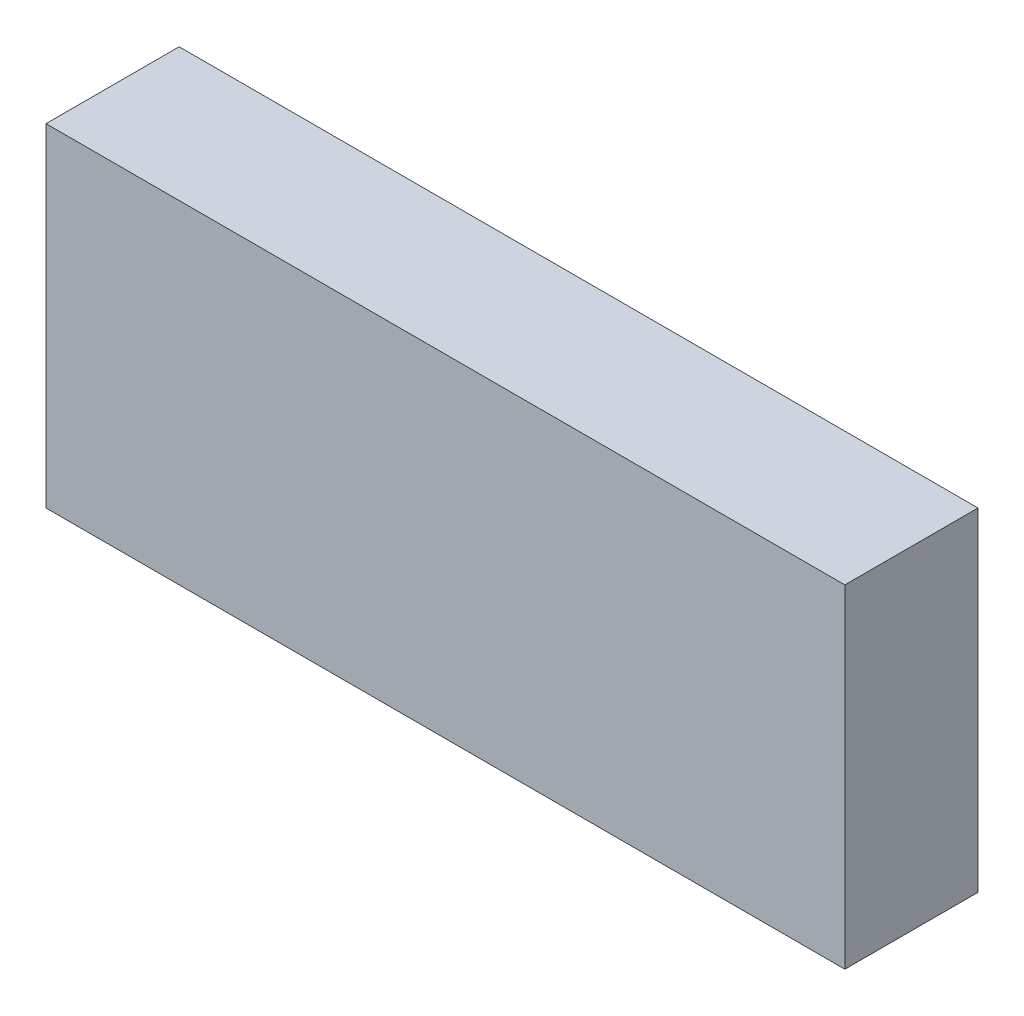
ISO-10303-21;
HEADER;
FILE_DESCRIPTION(('STEP AP214'),'2;1');
FILE_NAME('part.step','',(''),(''),'','','');
FILE_SCHEMA(('AUTOMOTIVE_DESIGN { 1 0 10303 214 1 1 1 1 }'));
ENDSEC;
DATA;
#1=APPLICATION_CONTEXT('core data for automotive mechanical design processes');
#2=APPLICATION_PROTOCOL_DEFINITION('international standard','automotive_design',2000,#1);
#3=PRODUCT_CONTEXT('',#1,'mechanical');
#4=PRODUCT('Part','Part','',(#3));
#5=PRODUCT_RELATED_PRODUCT_CATEGORY('part','',(#4));
#6=PRODUCT_DEFINITION_FORMATION('','',#4);
#7=PRODUCT_DEFINITION_CONTEXT('part definition',#1,'design');
#8=PRODUCT_DEFINITION('design','',#6,#7);
#9=PRODUCT_DEFINITION_SHAPE('','',#8);
#10=(LENGTH_UNIT() NAMED_UNIT(*) SI_UNIT(.MILLI.,.METRE.));
#11=(NAMED_UNIT(*) PLANE_ANGLE_UNIT() SI_UNIT($,.RADIAN.));
#12=(NAMED_UNIT(*) SI_UNIT($,.STERADIAN.) SOLID_ANGLE_UNIT());
#13=UNCERTAINTY_MEASURE_WITH_UNIT(LENGTH_MEASURE(1.E-05),#10,'distance_accuracy_value','');
#14=(GEOMETRIC_REPRESENTATION_CONTEXT(3) GLOBAL_UNCERTAINTY_ASSIGNED_CONTEXT((#13)) GLOBAL_UNIT_ASSIGNED_CONTEXT((#10,
#11,#12)) REPRESENTATION_CONTEXT('',''));
#15=CARTESIAN_POINT('',(0.,0.,0.));
#16=DIRECTION('',(0.,0.,1.));
#17=DIRECTION('',(1.,0.,0.));
#18=AXIS2_PLACEMENT_3D('',#15,#16,#17);
#19=CARTESIAN_POINT('',(-30.,0.,10.));
#20=DIRECTION('',(1.,0.,0.));
#21=DIRECTION('',(0.,0.,-1.));
#22=AXIS2_PLACEMENT_3D('',#19,#20,#21);
#23=PLANE('',#22);
#24=DIRECTION('',(0.,-1.,0.));
#25=VECTOR('',#24,1.);
#26=CARTESIAN_POINT('',(-30.,0.,0.));
#27=LINE('',#26,#25);
#28=CARTESIAN_POINT('',(-30.,25.,0.));
#29=VERTEX_POINT('',#28);
#30=CARTESIAN_POINT('',(-30.,0.,0.));
#31=VERTEX_POINT('',#30);
#32=EDGE_CURVE('E104',#29,#31,#27,.T.);
#33=ORIENTED_EDGE('',*,*,#32,.T.);
#34=DIRECTION('',(0.,0.,-1.));
#35=VECTOR('',#34,1.);
#36=CARTESIAN_POINT('',(-30.,0.,10.));
#37=LINE('',#36,#35);
#38=CARTESIAN_POINT('',(-30.,0.,10.));
#39=VERTEX_POINT('',#38);
#40=EDGE_CURVE('E11',#39,#31,#37,.T.);
#41=ORIENTED_EDGE('',*,*,#40,.F.);
#42=DIRECTION('',(0.,-1.,0.));
#43=VECTOR('',#42,1.);
#44=CARTESIAN_POINT('',(-30.,0.,10.));
#45=LINE('',#44,#43);
#46=CARTESIAN_POINT('',(-30.,25.,10.));
#47=VERTEX_POINT('',#46);
#48=EDGE_CURVE('E92',#47,#39,#45,.T.);
#49=ORIENTED_EDGE('',*,*,#48,.F.);
#50=DIRECTION('',(0.,0.,-1.));
#51=VECTOR('',#50,1.);
#52=CARTESIAN_POINT('',(-30.,25.,10.));
#53=LINE('',#52,#51);
#54=EDGE_CURVE('E100',#47,#29,#53,.T.);
#55=ORIENTED_EDGE('',*,*,#54,.T.);
#56=EDGE_LOOP('',(#33,#41,#49,#55));
#57=FACE_BOUND('',#56,.T.);
#58=ADVANCED_FACE('F41',(#57),#23,.F.);
#59=CARTESIAN_POINT('',(-30.,0.,10.));
#60=DIRECTION('',(0.,1.,0.));
#61=DIRECTION('',(0.,0.,1.));
#62=AXIS2_PLACEMENT_3D('',#59,#60,#61);
#63=PLANE('',#62);
#64=DIRECTION('',(1.,0.,0.));
#65=VECTOR('',#64,1.);
#66=CARTESIAN_POINT('',(-30.,0.,0.));
#67=LINE('',#66,#65);
#68=CARTESIAN_POINT('',(30.,0.,0.));
#69=VERTEX_POINT('',#68);
#70=EDGE_CURVE('E96',#31,#69,#67,.T.);
#71=ORIENTED_EDGE('',*,*,#70,.T.);
#72=DIRECTION('',(0.,0.,-1.));
#73=VECTOR('',#72,1.);
#74=CARTESIAN_POINT('',(30.,0.,10.));
#75=LINE('',#74,#73);
#76=CARTESIAN_POINT('',(30.,0.,10.));
#77=VERTEX_POINT('',#76);
#78=EDGE_CURVE('E49',#77,#69,#75,.T.);
#79=ORIENTED_EDGE('',*,*,#78,.F.);
#80=DIRECTION('',(1.,0.,0.));
#81=VECTOR('',#80,1.);
#82=CARTESIAN_POINT('',(-30.,0.,10.));
#83=LINE('',#82,#81);
#84=EDGE_CURVE('E87',#39,#77,#83,.T.);
#85=ORIENTED_EDGE('',*,*,#84,.F.);
#86=ORIENTED_EDGE('',*,*,#40,.T.);
#87=EDGE_LOOP('',(#71,#79,#85,#86));
#88=FACE_BOUND('',#87,.T.);
#89=ADVANCED_FACE('F95',(#88),#63,.F.);
#90=CARTESIAN_POINT('',(30.,0.,10.));
#91=DIRECTION('',(-1.,0.,0.));
#92=DIRECTION('',(0.,0.,1.));
#93=AXIS2_PLACEMENT_3D('',#90,#91,#92);
#94=PLANE('',#93);
#95=DIRECTION('',(0.,1.,0.));
#96=VECTOR('',#95,1.);
#97=CARTESIAN_POINT('',(30.,0.,0.));
#98=LINE('',#97,#96);
#99=CARTESIAN_POINT('',(30.,25.,0.));
#100=VERTEX_POINT('',#99);
#101=EDGE_CURVE('E74',#69,#100,#98,.T.);
#102=ORIENTED_EDGE('',*,*,#101,.T.);
#103=DIRECTION('',(0.,0.,-1.));
#104=VECTOR('',#103,1.);
#105=CARTESIAN_POINT('',(30.,25.,10.));
#106=LINE('',#105,#104);
#107=CARTESIAN_POINT('',(30.,25.,10.));
#108=VERTEX_POINT('',#107);
#109=EDGE_CURVE('E97',#108,#100,#106,.T.);
#110=ORIENTED_EDGE('',*,*,#109,.F.);
#111=DIRECTION('',(0.,1.,0.));
#112=VECTOR('',#111,1.);
#113=CARTESIAN_POINT('',(30.,0.,10.));
#114=LINE('',#113,#112);
#115=EDGE_CURVE('E90',#77,#108,#114,.T.);
#116=ORIENTED_EDGE('',*,*,#115,.F.);
#117=ORIENTED_EDGE('',*,*,#78,.T.);
#118=EDGE_LOOP('',(#102,#110,#116,#117));
#119=FACE_BOUND('',#118,.T.);
#120=ADVANCED_FACE('F98',(#119),#94,.F.);
#121=CARTESIAN_POINT('',(-30.,25.,10.));
#122=DIRECTION('',(0.,-1.,0.));
#123=DIRECTION('',(0.,0.,-1.));
#124=AXIS2_PLACEMENT_3D('',#121,#122,#123);
#125=PLANE('',#124);
#126=DIRECTION('',(-1.,0.,0.));
#127=VECTOR('',#126,1.);
#128=CARTESIAN_POINT('',(-30.,25.,0.));
#129=LINE('',#128,#127);
#130=EDGE_CURVE('E80',#100,#29,#129,.T.);
#131=ORIENTED_EDGE('',*,*,#130,.T.);
#132=ORIENTED_EDGE('',*,*,#54,.F.);
#133=DIRECTION('',(-1.,0.,0.));
#134=VECTOR('',#133,1.);
#135=CARTESIAN_POINT('',(-30.,25.,10.));
#136=LINE('',#135,#134);
#137=EDGE_CURVE('E57',#108,#47,#136,.T.);
#138=ORIENTED_EDGE('',*,*,#137,.F.);
#139=ORIENTED_EDGE('',*,*,#109,.T.);
#140=EDGE_LOOP('',(#131,#132,#138,#139));
#141=FACE_BOUND('',#140,.T.);
#142=ADVANCED_FACE('F111',(#141),#125,.F.);
#143=CARTESIAN_POINT('',(0.,0.,10.));
#144=DIRECTION('',(0.,0.,-1.));
#145=DIRECTION('',(-1.,0.,0.));
#146=AXIS2_PLACEMENT_3D('',#143,#144,#145);
#147=PLANE('',#146);
#148=ORIENTED_EDGE('',*,*,#48,.T.);
#149=ORIENTED_EDGE('',*,*,#84,.T.);
#150=ORIENTED_EDGE('',*,*,#115,.T.);
#151=ORIENTED_EDGE('',*,*,#137,.T.);
#152=EDGE_LOOP('',(#148,#149,#150,#151));
#153=FACE_BOUND('',#152,.T.);
#154=ADVANCED_FACE('F88',(#153),#147,.F.);
#155=CARTESIAN_POINT('',(0.,0.,0.));
#156=DIRECTION('',(0.,0.,-1.));
#157=DIRECTION('',(-1.,0.,0.));
#158=AXIS2_PLACEMENT_3D('',#155,#156,#157);
#159=PLANE('',#158);
#160=ORIENTED_EDGE('',*,*,#32,.F.);
#161=ORIENTED_EDGE('',*,*,#130,.F.);
#162=ORIENTED_EDGE('',*,*,#101,.F.);
#163=ORIENTED_EDGE('',*,*,#70,.F.);
#164=EDGE_LOOP('',(#160,#161,#162,#163));
#165=FACE_BOUND('',#164,.T.);
#166=ADVANCED_FACE('F114',(#165),#159,.T.);
#167=CLOSED_SHELL('',(#58,#89,#120,#142,#154,#166));
#168=MANIFOLD_SOLID_BREP('B2',#167);
#169=ADVANCED_BREP_SHAPE_REPRESENTATION('',(#18,#168),#14);
#170=SHAPE_DEFINITION_REPRESENTATION(#9,#169);
ENDSEC;
END-ISO-10303-21;
